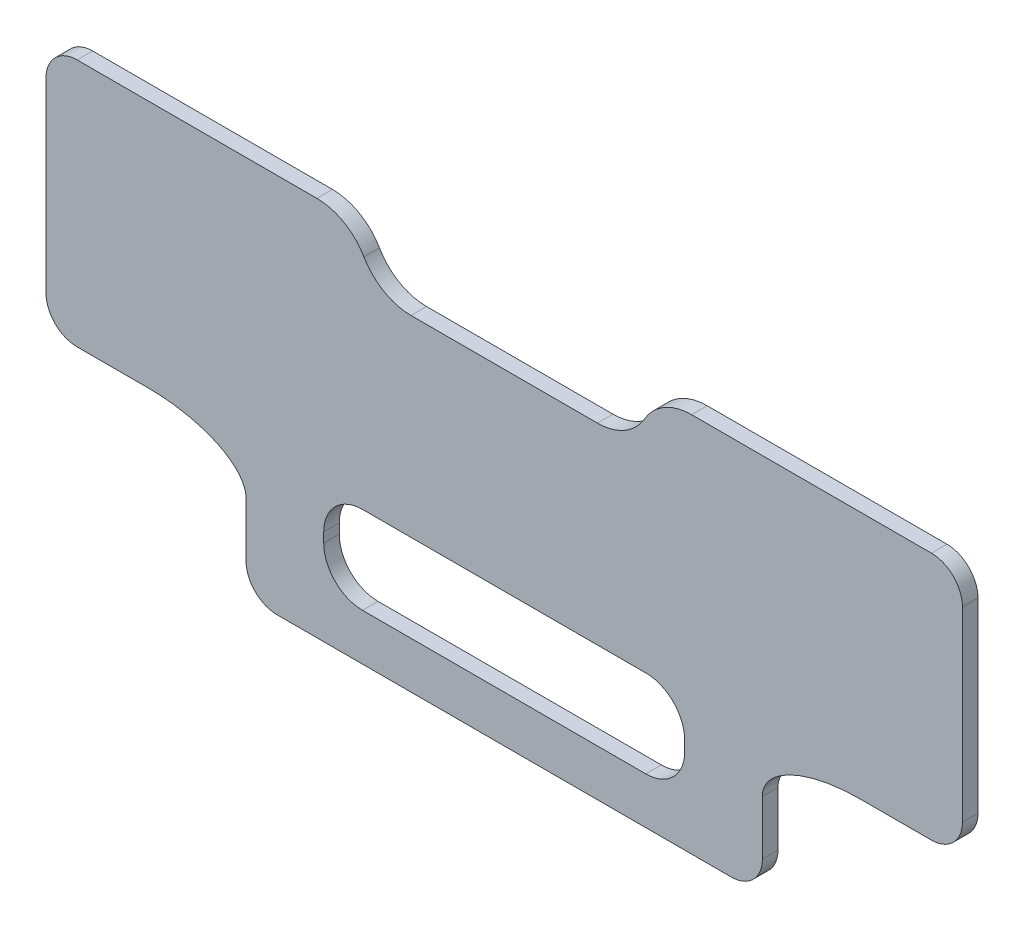
ISO-10303-21;
HEADER;
FILE_DESCRIPTION(('STEP AP214'),'2;1');
FILE_NAME('part.step','',(''),(''),'','','');
FILE_SCHEMA(('AUTOMOTIVE_DESIGN { 1 0 10303 214 1 1 1 1 }'));
ENDSEC;
DATA;
#1=APPLICATION_CONTEXT('core data for automotive mechanical design processes');
#2=APPLICATION_PROTOCOL_DEFINITION('international standard','automotive_design',2000,#1);
#3=PRODUCT_CONTEXT('',#1,'mechanical');
#4=PRODUCT('Part','Part','',(#3));
#5=PRODUCT_RELATED_PRODUCT_CATEGORY('part','',(#4));
#6=PRODUCT_DEFINITION_FORMATION('','',#4);
#7=PRODUCT_DEFINITION_CONTEXT('part definition',#1,'design');
#8=PRODUCT_DEFINITION('design','',#6,#7);
#9=PRODUCT_DEFINITION_SHAPE('','',#8);
#10=(LENGTH_UNIT() NAMED_UNIT(*) SI_UNIT(.MILLI.,.METRE.));
#11=(NAMED_UNIT(*) PLANE_ANGLE_UNIT() SI_UNIT($,.RADIAN.));
#12=(NAMED_UNIT(*) SI_UNIT($,.STERADIAN.) SOLID_ANGLE_UNIT());
#13=UNCERTAINTY_MEASURE_WITH_UNIT(LENGTH_MEASURE(1.E-05),#10,'distance_accuracy_value','');
#14=(GEOMETRIC_REPRESENTATION_CONTEXT(3) GLOBAL_UNCERTAINTY_ASSIGNED_CONTEXT((#13)) GLOBAL_UNIT_ASSIGNED_CONTEXT((#10,
#11,#12)) REPRESENTATION_CONTEXT('',''));
#15=CARTESIAN_POINT('',(0.,0.,0.));
#16=DIRECTION('',(0.,0.,1.));
#17=DIRECTION('',(1.,0.,0.));
#18=AXIS2_PLACEMENT_3D('',#15,#16,#17);
#19=CARTESIAN_POINT('',(59.,26.,2.));
#20=DIRECTION('',(0.,-1.,0.));
#21=DIRECTION('',(1.,0.,0.));
#22=AXIS2_PLACEMENT_3D('',#19,#20,#21);
#23=PLANE('',#22);
#24=DIRECTION('',(-1.,0.,0.));
#25=VECTOR('',#24,1.);
#26=CARTESIAN_POINT('',(59.,26.,0.));
#27=LINE('',#26,#25);
#28=CARTESIAN_POINT('',(-24.1243556529821,26.,0.));
#29=VERTEX_POINT('',#28);
#30=CARTESIAN_POINT('',(-55.,26.,0.));
#31=VERTEX_POINT('',#30);
#32=EDGE_CURVE('E292',#29,#31,#27,.T.);
#33=ORIENTED_EDGE('',*,*,#32,.T.);
#34=DIRECTION('',(0.,0.,-1.));
#35=VECTOR('',#34,1.);
#36=CARTESIAN_POINT('',(-55.,26.,2.));
#37=LINE('',#36,#35);
#38=CARTESIAN_POINT('',(-55.,26.,2.));
#39=VERTEX_POINT('',#38);
#40=EDGE_CURVE('E438',#31,#39,#37,.F.);
#41=ORIENTED_EDGE('',*,*,#40,.T.);
#42=DIRECTION('',(-1.,0.,0.));
#43=VECTOR('',#42,1.);
#44=CARTESIAN_POINT('',(59.,26.,2.));
#45=LINE('',#44,#43);
#46=CARTESIAN_POINT('',(-24.1243556529821,26.,2.));
#47=VERTEX_POINT('',#46);
#48=EDGE_CURVE('E286',#47,#39,#45,.T.);
#49=ORIENTED_EDGE('',*,*,#48,.F.);
#50=DIRECTION('',(0.,0.,-1.));
#51=VECTOR('',#50,1.);
#52=CARTESIAN_POINT('',(-24.1243556529821,26.,2.));
#53=LINE('',#52,#51);
#54=EDGE_CURVE('E377',#47,#29,#53,.T.);
#55=ORIENTED_EDGE('',*,*,#54,.T.);
#56=EDGE_LOOP('',(#33,#41,#49,#55));
#57=FACE_BOUND('',#56,.T.);
#58=ADVANCED_FACE('F37',(#57),#23,.F.);
#59=CARTESIAN_POINT('',(-59.,26.,2.));
#60=DIRECTION('',(1.,0.,0.));
#61=DIRECTION('',(0.,1.,0.));
#62=AXIS2_PLACEMENT_3D('',#59,#60,#61);
#63=PLANE('',#62);
#64=DIRECTION('',(0.,-1.,0.));
#65=VECTOR('',#64,1.);
#66=CARTESIAN_POINT('',(-59.,26.,2.));
#67=LINE('',#66,#65);
#68=CARTESIAN_POINT('',(-59.,22.,2.));
#69=VERTEX_POINT('',#68);
#70=CARTESIAN_POINT('',(-59.,-2.00000000000011,2.));
#71=VERTEX_POINT('',#70);
#72=EDGE_CURVE('E281',#69,#71,#67,.T.);
#73=ORIENTED_EDGE('',*,*,#72,.F.);
#74=DIRECTION('',(0.,0.,-1.));
#75=VECTOR('',#74,1.);
#76=CARTESIAN_POINT('',(-59.,22.,2.));
#77=LINE('',#76,#75);
#78=CARTESIAN_POINT('',(-59.,22.,0.));
#79=VERTEX_POINT('',#78);
#80=EDGE_CURVE('E431',#69,#79,#77,.T.);
#81=ORIENTED_EDGE('',*,*,#80,.T.);
#82=DIRECTION('',(0.,-1.,0.));
#83=VECTOR('',#82,1.);
#84=CARTESIAN_POINT('',(-59.,26.,0.));
#85=LINE('',#84,#83);
#86=CARTESIAN_POINT('',(-59.,-2.00000000000011,0.));
#87=VERTEX_POINT('',#86);
#88=EDGE_CURVE('E277',#79,#87,#85,.T.);
#89=ORIENTED_EDGE('',*,*,#88,.T.);
#90=DIRECTION('',(0.,0.,1.));
#91=VECTOR('',#90,1.);
#92=CARTESIAN_POINT('',(-59.,-2.00000000000011,2.));
#93=LINE('',#92,#91);
#94=EDGE_CURVE('E396',#87,#71,#93,.T.);
#95=ORIENTED_EDGE('',*,*,#94,.T.);
#96=EDGE_LOOP('',(#73,#81,#89,#95));
#97=FACE_BOUND('',#96,.T.);
#98=ADVANCED_FACE('F489',(#97),#63,.F.);
#99=CARTESIAN_POINT('',(59.,26.,2.));
#100=DIRECTION('',(-1.,0.,0.));
#101=DIRECTION('',(0.,0.,1.));
#102=AXIS2_PLACEMENT_3D('',#99,#100,#101);
#103=PLANE('',#102);
#104=DIRECTION('',(0.,1.,0.));
#105=VECTOR('',#104,1.);
#106=CARTESIAN_POINT('',(59.,26.,0.));
#107=LINE('',#106,#105);
#108=CARTESIAN_POINT('',(59.,-1.99999999999972,0.));
#109=VERTEX_POINT('',#108);
#110=CARTESIAN_POINT('',(59.,22.,0.));
#111=VERTEX_POINT('',#110);
#112=EDGE_CURVE('E290',#109,#111,#107,.T.);
#113=ORIENTED_EDGE('',*,*,#112,.T.);
#114=DIRECTION('',(0.,0.,-1.));
#115=VECTOR('',#114,1.);
#116=CARTESIAN_POINT('',(59.,22.,2.));
#117=LINE('',#116,#115);
#118=CARTESIAN_POINT('',(59.,22.,2.));
#119=VERTEX_POINT('',#118);
#120=EDGE_CURVE('E11',#111,#119,#117,.F.);
#121=ORIENTED_EDGE('',*,*,#120,.T.);
#122=DIRECTION('',(0.,1.,0.));
#123=VECTOR('',#122,1.);
#124=CARTESIAN_POINT('',(59.,26.,2.));
#125=LINE('',#124,#123);
#126=CARTESIAN_POINT('',(59.,-1.99999999999972,2.));
#127=VERTEX_POINT('',#126);
#128=EDGE_CURVE('E283',#127,#119,#125,.T.);
#129=ORIENTED_EDGE('',*,*,#128,.F.);
#130=DIRECTION('',(0.,0.,1.));
#131=VECTOR('',#130,1.);
#132=CARTESIAN_POINT('',(59.,-1.99999999999973,0.));
#133=LINE('',#132,#131);
#134=EDGE_CURVE('E419',#127,#109,#133,.F.);
#135=ORIENTED_EDGE('',*,*,#134,.T.);
#136=EDGE_LOOP('',(#113,#121,#129,#135));
#137=FACE_BOUND('',#136,.T.);
#138=ADVANCED_FACE('F529',(#137),#103,.F.);
#139=CARTESIAN_POINT('',(0.,0.,2.));
#140=DIRECTION('',(0.,0.,-1.));
#141=DIRECTION('',(-1.,0.,0.));
#142=AXIS2_PLACEMENT_3D('',#139,#140,#141);
#143=PLANE('',#142);
#144=DIRECTION('',(1.,0.,0.));
#145=VECTOR('',#144,1.);
#146=CARTESIAN_POINT('',(-23.2417454910334,-17.,2.));
#147=LINE('',#146,#145);
#148=CARTESIAN_POINT('',(-18.2417454910334,-17.,2.));
#149=VERTEX_POINT('',#148);
#150=CARTESIAN_POINT('',(18.241745491033,-17.,2.));
#151=VERTEX_POINT('',#150);
#152=EDGE_CURVE('E895',#149,#151,#147,.T.);
#153=ORIENTED_EDGE('',*,*,#152,.F.);
#154=CARTESIAN_POINT('',(-18.2417454910334,-12.,2.));
#155=DIRECTION('',(0.,0.,-1.));
#156=DIRECTION('',(-1.,0.,0.));
#157=AXIS2_PLACEMENT_3D('',#154,#155,#156);
#158=CIRCLE('',#157,5.);
#159=CARTESIAN_POINT('',(-23.2417454910334,-12.,2.));
#160=VERTEX_POINT('',#159);
#161=EDGE_CURVE('E354',#149,#160,#158,.T.);
#162=ORIENTED_EDGE('',*,*,#161,.T.);
#163=DIRECTION('',(0.,-1.,0.));
#164=VECTOR('',#163,1.);
#165=CARTESIAN_POINT('',(-23.2417454910334,-17.,2.));
#166=LINE('',#165,#164);
#167=CARTESIAN_POINT('',(-23.2417454910334,-10.7473478503629,2.));
#168=VERTEX_POINT('',#167);
#169=EDGE_CURVE('E888',#168,#160,#166,.T.);
#170=ORIENTED_EDGE('',*,*,#169,.F.);
#171=CARTESIAN_POINT('',(-18.2417454910334,-10.7473478503629,2.));
#172=DIRECTION('',(0.,0.,-1.));
#173=DIRECTION('',(-1.,0.,0.));
#174=AXIS2_PLACEMENT_3D('',#171,#172,#173);
#175=CIRCLE('',#174,5.);
#176=CARTESIAN_POINT('',(-18.2417454910334,-5.74734785036292,2.));
#177=VERTEX_POINT('',#176);
#178=EDGE_CURVE('E358',#168,#177,#175,.T.);
#179=ORIENTED_EDGE('',*,*,#178,.T.);
#180=DIRECTION('',(-1.,0.,0.));
#181=VECTOR('',#180,1.);
#182=CARTESIAN_POINT('',(-23.2417454910334,-5.74734785036292,2.));
#183=LINE('',#182,#181);
#184=CARTESIAN_POINT('',(18.241745491033,-5.74734785036292,2.));
#185=VERTEX_POINT('',#184);
#186=EDGE_CURVE('E906',#185,#177,#183,.T.);
#187=ORIENTED_EDGE('',*,*,#186,.F.);
#188=CARTESIAN_POINT('',(18.241745491033,-10.7473478503629,2.));
#189=DIRECTION('',(0.,0.,-1.));
#190=DIRECTION('',(-1.,0.,0.));
#191=AXIS2_PLACEMENT_3D('',#188,#189,#190);
#192=CIRCLE('',#191,5.);
#193=CARTESIAN_POINT('',(23.241745491033,-10.7473478503629,2.));
#194=VERTEX_POINT('',#193);
#195=EDGE_CURVE('E350',#185,#194,#192,.T.);
#196=ORIENTED_EDGE('',*,*,#195,.T.);
#197=DIRECTION('',(0.,1.,0.));
#198=VECTOR('',#197,1.);
#199=CARTESIAN_POINT('',(23.241745491033,-17.,2.));
#200=LINE('',#199,#198);
#201=CARTESIAN_POINT('',(23.241745491033,-12.,2.));
#202=VERTEX_POINT('',#201);
#203=EDGE_CURVE('E902',#202,#194,#200,.T.);
#204=ORIENTED_EDGE('',*,*,#203,.F.);
#205=CARTESIAN_POINT('',(18.241745491033,-12.,2.));
#206=DIRECTION('',(0.,0.,-1.));
#207=DIRECTION('',(-1.,0.,0.));
#208=AXIS2_PLACEMENT_3D('',#205,#206,#207);
#209=CIRCLE('',#208,5.);
#210=EDGE_CURVE('E346',#202,#151,#209,.T.);
#211=ORIENTED_EDGE('',*,*,#210,.T.);
#212=EDGE_LOOP('',(#153,#162,#170,#179,#187,#196,#204,#211));
#213=FACE_BOUND('',#212,.T.);
#214=ORIENTED_EDGE('',*,*,#48,.T.);
#215=CARTESIAN_POINT('',(-55.,22.,2.));
#216=DIRECTION('',(0.,0.,-1.));
#217=DIRECTION('',(-1.,0.,0.));
#218=AXIS2_PLACEMENT_3D('',#215,#216,#217);
#219=CIRCLE('',#218,4.);
#220=EDGE_CURVE('E441',#39,#69,#219,.F.);
#221=ORIENTED_EDGE('',*,*,#220,.T.);
#222=ORIENTED_EDGE('',*,*,#72,.T.);
#223=CARTESIAN_POINT('',(-55.,-2.00000000000011,2.));
#224=DIRECTION('',(0.,0.,-1.));
#225=DIRECTION('',(-1.,0.,0.));
#226=AXIS2_PLACEMENT_3D('',#223,#224,#225);
#227=CIRCLE('',#226,4.);
#228=CARTESIAN_POINT('',(-55.,-6.00000000000011,2.));
#229=VERTEX_POINT('',#228);
#230=EDGE_CURVE('E405',#71,#229,#227,.F.);
#231=ORIENTED_EDGE('',*,*,#230,.T.);
#232=DIRECTION('',(1.,0.,0.));
#233=VECTOR('',#232,1.);
#234=CARTESIAN_POINT('',(0.,-5.99999999999991,2.));
#235=LINE('',#234,#233);
#236=CARTESIAN_POINT('',(-45.8693656200782,-6.00000000000008,2.));
#237=VERTEX_POINT('',#236);
#238=EDGE_CURVE('E245',#229,#237,#235,.T.);
#239=ORIENTED_EDGE('',*,*,#238,.T.);
#240=CARTESIAN_POINT('',(-45.8693656200782,-12.0000000000001,2.));
#241=DIRECTION('',(0.,0.,1.));
#242=DIRECTION('',(-1.,0.,0.));
#243=AXIS2_PLACEMENT_3D('',#240,#241,#242);
#244=ELLIPSE('',#243,12.6276201290448,6.);
#245=CARTESIAN_POINT('',(-33.2417454910334,-12.,2.));
#246=VERTEX_POINT('',#245);
#247=EDGE_CURVE('E270',#246,#237,#244,.T.);
#248=ORIENTED_EDGE('',*,*,#247,.F.);
#249=DIRECTION('',(0.,-1.,0.));
#250=VECTOR('',#249,1.);
#251=CARTESIAN_POINT('',(-33.2417454910335,-1.25815060987073E-13,2.));
#252=LINE('',#251,#250);
#253=CARTESIAN_POINT('',(-33.2417454910334,-19.,2.));
#254=VERTEX_POINT('',#253);
#255=EDGE_CURVE('E267',#246,#254,#252,.T.);
#256=ORIENTED_EDGE('',*,*,#255,.T.);
#257=CARTESIAN_POINT('',(-29.2417454910334,-19.,2.));
#258=DIRECTION('',(0.,0.,-1.));
#259=DIRECTION('',(-1.,0.,0.));
#260=AXIS2_PLACEMENT_3D('',#257,#258,#259);
#261=CIRCLE('',#260,4.);
#262=CARTESIAN_POINT('',(-29.2417454910334,-23.,2.));
#263=VERTEX_POINT('',#262);
#264=EDGE_CURVE('E399',#254,#263,#261,.F.);
#265=ORIENTED_EDGE('',*,*,#264,.T.);
#266=DIRECTION('',(1.,0.,0.));
#267=VECTOR('',#266,1.);
#268=CARTESIAN_POINT('',(0.,-22.9999999999999,2.));
#269=LINE('',#268,#267);
#270=CARTESIAN_POINT('',(29.241745491033,-22.9999999999998,2.));
#271=VERTEX_POINT('',#270);
#272=EDGE_CURVE('E261',#263,#271,#269,.T.);
#273=ORIENTED_EDGE('',*,*,#272,.T.);
#274=CARTESIAN_POINT('',(29.241745491033,-18.9999999999998,2.));
#275=DIRECTION('',(0.,0.,-1.));
#276=DIRECTION('',(-1.,0.,0.));
#277=AXIS2_PLACEMENT_3D('',#274,#275,#276);
#278=CIRCLE('',#277,4.);
#279=CARTESIAN_POINT('',(33.241745491033,-18.9999999999998,2.));
#280=VERTEX_POINT('',#279);
#281=EDGE_CURVE('E401',#271,#280,#278,.F.);
#282=ORIENTED_EDGE('',*,*,#281,.T.);
#283=DIRECTION('',(0.,1.,0.));
#284=VECTOR('',#283,1.);
#285=CARTESIAN_POINT('',(33.2417454910329,1.4678423781825E-13,2.));
#286=LINE('',#285,#284);
#287=CARTESIAN_POINT('',(33.2417454910329,-11.9999999999998,2.));
#288=VERTEX_POINT('',#287);
#289=EDGE_CURVE('E258',#280,#288,#286,.T.);
#290=ORIENTED_EDGE('',*,*,#289,.T.);
#291=CARTESIAN_POINT('',(45.8693656200778,-11.9999999999998,2.));
#292=DIRECTION('',(0.,0.,1.));
#293=DIRECTION('',(1.,0.,0.));
#294=AXIS2_PLACEMENT_3D('',#291,#292,#293);
#295=ELLIPSE('',#294,12.6276201290448,6.);
#296=CARTESIAN_POINT('',(45.8693656200777,-5.99999999999976,2.));
#297=VERTEX_POINT('',#296);
#298=EDGE_CURVE('E239',#297,#288,#295,.T.);
#299=ORIENTED_EDGE('',*,*,#298,.F.);
#300=DIRECTION('',(1.,0.,0.));
#301=VECTOR('',#300,1.);
#302=CARTESIAN_POINT('',(0.,-5.99999999999992,2.));
#303=LINE('',#302,#301);
#304=CARTESIAN_POINT('',(55.,-5.99999999999973,2.));
#305=VERTEX_POINT('',#304);
#306=EDGE_CURVE('E249',#297,#305,#303,.T.);
#307=ORIENTED_EDGE('',*,*,#306,.T.);
#308=CARTESIAN_POINT('',(55.,-1.99999999999973,2.));
#309=DIRECTION('',(0.,0.,-1.));
#310=DIRECTION('',(-1.,0.,0.));
#311=AXIS2_PLACEMENT_3D('',#308,#309,#310);
#312=CIRCLE('',#311,4.);
#313=EDGE_CURVE('E403',#305,#127,#312,.F.);
#314=ORIENTED_EDGE('',*,*,#313,.T.);
#315=ORIENTED_EDGE('',*,*,#128,.T.);
#316=CARTESIAN_POINT('',(55.,22.,2.));
#317=DIRECTION('',(0.,0.,-1.));
#318=DIRECTION('',(-1.,0.,0.));
#319=AXIS2_PLACEMENT_3D('',#316,#317,#318);
#320=CIRCLE('',#319,4.);
#321=CARTESIAN_POINT('',(55.,26.,2.));
#322=VERTEX_POINT('',#321);
#323=EDGE_CURVE('E52',#119,#322,#320,.F.);
#324=ORIENTED_EDGE('',*,*,#323,.T.);
#325=CARTESIAN_POINT('',(24.1243556529821,26.,2.));
#326=VERTEX_POINT('',#325);
#327=EDGE_CURVE('E287',#322,#326,#45,.T.);
#328=ORIENTED_EDGE('',*,*,#327,.T.);
#329=CARTESIAN_POINT('',(24.1243556529821,19.,2.));
#330=DIRECTION('',(0.,0.,-1.));
#331=DIRECTION('',(-1.,0.,0.));
#332=AXIS2_PLACEMENT_3D('',#329,#330,#331);
#333=CIRCLE('',#332,7.);
#334=CARTESIAN_POINT('',(18.0621778264911,22.5,2.));
#335=VERTEX_POINT('',#334);
#336=EDGE_CURVE('E387',#326,#335,#333,.F.);
#337=ORIENTED_EDGE('',*,*,#336,.T.);
#338=CARTESIAN_POINT('',(12.,26.,2.));
#339=DIRECTION('',(0.,0.,-1.));
#340=DIRECTION('',(-1.,0.,0.));
#341=AXIS2_PLACEMENT_3D('',#338,#339,#340);
#342=CIRCLE('',#341,7.);
#343=CARTESIAN_POINT('',(12.,19.,2.));
#344=VERTEX_POINT('',#343);
#345=EDGE_CURVE('E367',#335,#344,#342,.T.);
#346=ORIENTED_EDGE('',*,*,#345,.T.);
#347=DIRECTION('',(1.,0.,0.));
#348=VECTOR('',#347,1.);
#349=CARTESIAN_POINT('',(-19.,19.,2.));
#350=LINE('',#349,#348);
#351=CARTESIAN_POINT('',(-12.,19.,2.));
#352=VERTEX_POINT('',#351);
#353=EDGE_CURVE('E253',#352,#344,#350,.T.);
#354=ORIENTED_EDGE('',*,*,#353,.F.);
#355=CARTESIAN_POINT('',(-12.,26.,2.));
#356=DIRECTION('',(0.,0.,-1.));
#357=DIRECTION('',(-1.,0.,0.));
#358=AXIS2_PLACEMENT_3D('',#355,#356,#357);
#359=CIRCLE('',#358,7.);
#360=CARTESIAN_POINT('',(-18.0621778264911,22.5,2.));
#361=VERTEX_POINT('',#360);
#362=EDGE_CURVE('E372',#352,#361,#359,.T.);
#363=ORIENTED_EDGE('',*,*,#362,.T.);
#364=CARTESIAN_POINT('',(-24.1243556529821,19.,2.));
#365=DIRECTION('',(0.,0.,-1.));
#366=DIRECTION('',(-1.,0.,0.));
#367=AXIS2_PLACEMENT_3D('',#364,#365,#366);
#368=CIRCLE('',#367,7.);
#369=EDGE_CURVE('E389',#361,#47,#368,.F.);
#370=ORIENTED_EDGE('',*,*,#369,.T.);
#371=EDGE_LOOP('',(#214,#221,#222,#231,#239,#248,#256,#265,#273,#282,#290,#299,#307,#314,#315,
#324,#328,#337,#346,#354,#363,#370));
#372=FACE_BOUND('',#371,.T.);
#373=ADVANCED_FACE('F256',(#213,#372),#143,.F.);
#374=CARTESIAN_POINT('',(0.,0.,0.));
#375=DIRECTION('',(0.,0.,-1.));
#376=DIRECTION('',(-1.,0.,0.));
#377=AXIS2_PLACEMENT_3D('',#374,#375,#376);
#378=PLANE('',#377);
#379=DIRECTION('',(0.,1.,0.));
#380=VECTOR('',#379,1.);
#381=CARTESIAN_POINT('',(-23.2417454910334,0.,0.));
#382=LINE('',#381,#380);
#383=CARTESIAN_POINT('',(-23.2417454910334,-12.,0.));
#384=VERTEX_POINT('',#383);
#385=CARTESIAN_POINT('',(-23.2417454910334,-10.7473478503629,0.));
#386=VERTEX_POINT('',#385);
#387=EDGE_CURVE('E323',#384,#386,#382,.T.);
#388=ORIENTED_EDGE('',*,*,#387,.F.);
#389=CARTESIAN_POINT('',(-18.2417454910334,-12.,0.));
#390=DIRECTION('',(0.,0.,-1.));
#391=DIRECTION('',(-1.,0.,0.));
#392=AXIS2_PLACEMENT_3D('',#389,#390,#391);
#393=CIRCLE('',#392,5.);
#394=CARTESIAN_POINT('',(-18.2417454910334,-17.,0.));
#395=VERTEX_POINT('',#394);
#396=EDGE_CURVE('E356',#384,#395,#393,.F.);
#397=ORIENTED_EDGE('',*,*,#396,.T.);
#398=DIRECTION('',(-1.,0.,0.));
#399=VECTOR('',#398,1.);
#400=CARTESIAN_POINT('',(0.,-17.,0.));
#401=LINE('',#400,#399);
#402=CARTESIAN_POINT('',(18.241745491033,-17.,0.));
#403=VERTEX_POINT('',#402);
#404=EDGE_CURVE('E314',#403,#395,#401,.T.);
#405=ORIENTED_EDGE('',*,*,#404,.F.);
#406=CARTESIAN_POINT('',(18.241745491033,-12.,0.));
#407=DIRECTION('',(0.,0.,-1.));
#408=DIRECTION('',(-1.,0.,0.));
#409=AXIS2_PLACEMENT_3D('',#406,#407,#408);
#410=CIRCLE('',#409,5.);
#411=CARTESIAN_POINT('',(23.241745491033,-12.,0.));
#412=VERTEX_POINT('',#411);
#413=EDGE_CURVE('E348',#403,#412,#410,.F.);
#414=ORIENTED_EDGE('',*,*,#413,.T.);
#415=DIRECTION('',(0.,-1.,0.));
#416=VECTOR('',#415,1.);
#417=CARTESIAN_POINT('',(23.241745491033,0.,0.));
#418=LINE('',#417,#416);
#419=CARTESIAN_POINT('',(23.241745491033,-10.7473478503629,0.));
#420=VERTEX_POINT('',#419);
#421=EDGE_CURVE('E317',#420,#412,#418,.T.);
#422=ORIENTED_EDGE('',*,*,#421,.F.);
#423=CARTESIAN_POINT('',(18.241745491033,-10.7473478503629,0.));
#424=DIRECTION('',(0.,0.,-1.));
#425=DIRECTION('',(-1.,0.,0.));
#426=AXIS2_PLACEMENT_3D('',#423,#424,#425);
#427=CIRCLE('',#426,5.);
#428=CARTESIAN_POINT('',(18.241745491033,-5.74734785036292,0.));
#429=VERTEX_POINT('',#428);
#430=EDGE_CURVE('E352',#420,#429,#427,.F.);
#431=ORIENTED_EDGE('',*,*,#430,.T.);
#432=DIRECTION('',(1.,0.,0.));
#433=VECTOR('',#432,1.);
#434=CARTESIAN_POINT('',(0.,-5.74734785036292,0.));
#435=LINE('',#434,#433);
#436=CARTESIAN_POINT('',(-18.2417454910334,-5.74734785036292,0.));
#437=VERTEX_POINT('',#436);
#438=EDGE_CURVE('E320',#437,#429,#435,.T.);
#439=ORIENTED_EDGE('',*,*,#438,.F.);
#440=CARTESIAN_POINT('',(-18.2417454910334,-10.7473478503629,0.));
#441=DIRECTION('',(0.,0.,-1.));
#442=DIRECTION('',(-1.,0.,0.));
#443=AXIS2_PLACEMENT_3D('',#440,#441,#442);
#444=CIRCLE('',#443,5.);
#445=EDGE_CURVE('E360',#437,#386,#444,.F.);
#446=ORIENTED_EDGE('',*,*,#445,.T.);
#447=EDGE_LOOP('',(#388,#397,#405,#414,#422,#431,#439,#446));
#448=FACE_BOUND('',#447,.T.);
#449=ORIENTED_EDGE('',*,*,#88,.F.);
#450=CARTESIAN_POINT('',(-55.,22.,0.));
#451=DIRECTION('',(0.,0.,-1.));
#452=DIRECTION('',(-1.,0.,0.));
#453=AXIS2_PLACEMENT_3D('',#450,#451,#452);
#454=CIRCLE('',#453,4.);
#455=EDGE_CURVE('E436',#79,#31,#454,.T.);
#456=ORIENTED_EDGE('',*,*,#455,.T.);
#457=ORIENTED_EDGE('',*,*,#32,.F.);
#458=CARTESIAN_POINT('',(-24.1243556529821,19.,0.));
#459=DIRECTION('',(0.,0.,-1.));
#460=DIRECTION('',(-1.,0.,0.));
#461=AXIS2_PLACEMENT_3D('',#458,#459,#460);
#462=CIRCLE('',#461,7.);
#463=CARTESIAN_POINT('',(-18.0621778264911,22.5,0.));
#464=VERTEX_POINT('',#463);
#465=EDGE_CURVE('E383',#29,#464,#462,.T.);
#466=ORIENTED_EDGE('',*,*,#465,.T.);
#467=CARTESIAN_POINT('',(-12.,26.,0.));
#468=DIRECTION('',(0.,0.,-1.));
#469=DIRECTION('',(-1.,0.,0.));
#470=AXIS2_PLACEMENT_3D('',#467,#468,#469);
#471=CIRCLE('',#470,7.);
#472=CARTESIAN_POINT('',(-12.,19.,0.));
#473=VERTEX_POINT('',#472);
#474=EDGE_CURVE('E375',#464,#473,#471,.F.);
#475=ORIENTED_EDGE('',*,*,#474,.T.);
#476=DIRECTION('',(-1.,0.,0.));
#477=VECTOR('',#476,1.);
#478=CARTESIAN_POINT('',(0.,19.,0.));
#479=LINE('',#478,#477);
#480=CARTESIAN_POINT('',(12.,19.,0.));
#481=VERTEX_POINT('',#480);
#482=EDGE_CURVE('E311',#481,#473,#479,.T.);
#483=ORIENTED_EDGE('',*,*,#482,.F.);
#484=CARTESIAN_POINT('',(12.,26.,0.));
#485=DIRECTION('',(0.,0.,-1.));
#486=DIRECTION('',(-1.,0.,0.));
#487=AXIS2_PLACEMENT_3D('',#484,#485,#486);
#488=CIRCLE('',#487,7.);
#489=CARTESIAN_POINT('',(18.0621778264911,22.5,0.));
#490=VERTEX_POINT('',#489);
#491=EDGE_CURVE('E369',#481,#490,#488,.F.);
#492=ORIENTED_EDGE('',*,*,#491,.T.);
#493=CARTESIAN_POINT('',(24.1243556529821,19.,0.));
#494=DIRECTION('',(0.,0.,-1.));
#495=DIRECTION('',(-1.,0.,0.));
#496=AXIS2_PLACEMENT_3D('',#493,#494,#495);
#497=CIRCLE('',#496,7.);
#498=CARTESIAN_POINT('',(24.1243556529821,26.,0.));
#499=VERTEX_POINT('',#498);
#500=EDGE_CURVE('E380',#490,#499,#497,.T.);
#501=ORIENTED_EDGE('',*,*,#500,.T.);
#502=CARTESIAN_POINT('',(55.,26.,0.));
#503=VERTEX_POINT('',#502);
#504=EDGE_CURVE('E284',#503,#499,#27,.T.);
#505=ORIENTED_EDGE('',*,*,#504,.F.);
#506=CARTESIAN_POINT('',(55.,22.,0.));
#507=DIRECTION('',(0.,0.,-1.));
#508=DIRECTION('',(-1.,0.,0.));
#509=AXIS2_PLACEMENT_3D('',#506,#507,#508);
#510=CIRCLE('',#509,4.);
#511=EDGE_CURVE('E434',#503,#111,#510,.T.);
#512=ORIENTED_EDGE('',*,*,#511,.T.);
#513=ORIENTED_EDGE('',*,*,#112,.F.);
#514=CARTESIAN_POINT('',(55.,-1.99999999999973,0.));
#515=DIRECTION('',(0.,0.,-1.));
#516=DIRECTION('',(-1.,0.,0.));
#517=AXIS2_PLACEMENT_3D('',#514,#515,#516);
#518=CIRCLE('',#517,4.);
#519=CARTESIAN_POINT('',(55.,-5.99999999999973,0.));
#520=VERTEX_POINT('',#519);
#521=EDGE_CURVE('E413',#109,#520,#518,.T.);
#522=ORIENTED_EDGE('',*,*,#521,.T.);
#523=DIRECTION('',(-1.,0.,0.));
#524=VECTOR('',#523,1.);
#525=CARTESIAN_POINT('',(0.,-5.99999999999992,0.));
#526=LINE('',#525,#524);
#527=CARTESIAN_POINT('',(45.8693656200777,-5.99999999999976,0.));
#528=VERTEX_POINT('',#527);
#529=EDGE_CURVE('E309',#520,#528,#526,.T.);
#530=ORIENTED_EDGE('',*,*,#529,.T.);
#531=CARTESIAN_POINT('',(45.8693656200778,-11.9999999999998,0.));
#532=DIRECTION('',(0.,0.,1.));
#533=DIRECTION('',(1.,0.,0.));
#534=AXIS2_PLACEMENT_3D('',#531,#532,#533);
#535=ELLIPSE('',#534,12.6276201290448,6.);
#536=CARTESIAN_POINT('',(33.2417454910329,-11.9999999999998,0.));
#537=VERTEX_POINT('',#536);
#538=EDGE_CURVE('E241',#537,#528,#535,.F.);
#539=ORIENTED_EDGE('',*,*,#538,.F.);
#540=DIRECTION('',(0.,-1.,0.));
#541=VECTOR('',#540,1.);
#542=CARTESIAN_POINT('',(33.2417454910329,1.4678423781825E-13,0.));
#543=LINE('',#542,#541);
#544=CARTESIAN_POINT('',(33.241745491033,-18.9999999999998,0.));
#545=VERTEX_POINT('',#544);
#546=EDGE_CURVE('E295',#537,#545,#543,.T.);
#547=ORIENTED_EDGE('',*,*,#546,.T.);
#548=CARTESIAN_POINT('',(29.241745491033,-18.9999999999998,0.));
#549=DIRECTION('',(0.,0.,-1.));
#550=DIRECTION('',(-1.,0.,0.));
#551=AXIS2_PLACEMENT_3D('',#548,#549,#550);
#552=CIRCLE('',#551,4.);
#553=CARTESIAN_POINT('',(29.241745491033,-22.9999999999998,0.));
#554=VERTEX_POINT('',#553);
#555=EDGE_CURVE('E411',#545,#554,#552,.T.);
#556=ORIENTED_EDGE('',*,*,#555,.T.);
#557=DIRECTION('',(-1.,0.,0.));
#558=VECTOR('',#557,1.);
#559=CARTESIAN_POINT('',(0.,-22.9999999999999,0.));
#560=LINE('',#559,#558);
#561=CARTESIAN_POINT('',(-29.2417454910334,-23.,0.));
#562=VERTEX_POINT('',#561);
#563=EDGE_CURVE('E298',#554,#562,#560,.T.);
#564=ORIENTED_EDGE('',*,*,#563,.T.);
#565=CARTESIAN_POINT('',(-29.2417454910334,-19.,0.));
#566=DIRECTION('',(0.,0.,-1.));
#567=DIRECTION('',(-1.,0.,0.));
#568=AXIS2_PLACEMENT_3D('',#565,#566,#567);
#569=CIRCLE('',#568,4.);
#570=CARTESIAN_POINT('',(-33.2417454910334,-19.,0.));
#571=VERTEX_POINT('',#570);
#572=EDGE_CURVE('E409',#562,#571,#569,.T.);
#573=ORIENTED_EDGE('',*,*,#572,.T.);
#574=DIRECTION('',(0.,1.,0.));
#575=VECTOR('',#574,1.);
#576=CARTESIAN_POINT('',(-33.2417454910335,-1.25815060987073E-13,0.));
#577=LINE('',#576,#575);
#578=CARTESIAN_POINT('',(-33.2417454910334,-12.,0.));
#579=VERTEX_POINT('',#578);
#580=EDGE_CURVE('E301',#571,#579,#577,.T.);
#581=ORIENTED_EDGE('',*,*,#580,.T.);
#582=CARTESIAN_POINT('',(-45.8693656200782,-12.0000000000001,0.));
#583=DIRECTION('',(0.,0.,1.));
#584=DIRECTION('',(-1.,0.,0.));
#585=AXIS2_PLACEMENT_3D('',#582,#583,#584);
#586=ELLIPSE('',#585,12.6276201290448,6.);
#587=CARTESIAN_POINT('',(-45.8693656200782,-6.00000000000008,0.));
#588=VERTEX_POINT('',#587);
#589=EDGE_CURVE('E303',#588,#579,#586,.F.);
#590=ORIENTED_EDGE('',*,*,#589,.F.);
#591=DIRECTION('',(-1.,0.,0.));
#592=VECTOR('',#591,1.);
#593=CARTESIAN_POINT('',(0.,-5.99999999999991,0.));
#594=LINE('',#593,#592);
#595=CARTESIAN_POINT('',(-55.,-6.00000000000011,0.));
#596=VERTEX_POINT('',#595);
#597=EDGE_CURVE('E306',#588,#596,#594,.T.);
#598=ORIENTED_EDGE('',*,*,#597,.T.);
#599=CARTESIAN_POINT('',(-55.,-2.00000000000011,0.));
#600=DIRECTION('',(0.,0.,-1.));
#601=DIRECTION('',(-1.,0.,0.));
#602=AXIS2_PLACEMENT_3D('',#599,#600,#601);
#603=CIRCLE('',#602,4.);
#604=EDGE_CURVE('E415',#596,#87,#603,.T.);
#605=ORIENTED_EDGE('',*,*,#604,.T.);
#606=EDGE_LOOP('',(#449,#456,#457,#466,#475,#483,#492,#501,#505,#512,#513,#522,#530,#539,#547,
#556,#564,#573,#581,#590,#598,#605));
#607=FACE_BOUND('',#606,.T.);
#608=ADVANCED_FACE('F450',(#448,#607),#378,.T.);
#609=ORIENTED_EDGE('',*,*,#327,.F.);
#610=DIRECTION('',(0.,0.,-1.));
#611=VECTOR('',#610,1.);
#612=CARTESIAN_POINT('',(55.,26.,2.));
#613=LINE('',#612,#611);
#614=EDGE_CURVE('E45',#322,#503,#613,.T.);
#615=ORIENTED_EDGE('',*,*,#614,.T.);
#616=ORIENTED_EDGE('',*,*,#504,.T.);
#617=DIRECTION('',(0.,0.,-1.));
#618=VECTOR('',#617,1.);
#619=CARTESIAN_POINT('',(24.1243556529821,26.,2.));
#620=LINE('',#619,#618);
#621=EDGE_CURVE('E391',#499,#326,#620,.F.);
#622=ORIENTED_EDGE('',*,*,#621,.T.);
#623=EDGE_LOOP('',(#609,#615,#616,#622));
#624=FACE_BOUND('',#623,.T.);
#625=ADVANCED_FACE('F446',(#624),#23,.F.);
#626=CARTESIAN_POINT('',(0.,-5.99999999999992,-8.));
#627=DIRECTION('',(0.,-1.,0.));
#628=DIRECTION('',(1.,0.,0.));
#629=AXIS2_PLACEMENT_3D('',#626,#627,#628);
#630=PLANE('',#629);
#631=ORIENTED_EDGE('',*,*,#529,.F.);
#632=DIRECTION('',(0.,0.,1.));
#633=VECTOR('',#632,1.);
#634=CARTESIAN_POINT('',(55.,-5.99999999999973,2.));
#635=LINE('',#634,#633);
#636=EDGE_CURVE('E252',#520,#305,#635,.T.);
#637=ORIENTED_EDGE('',*,*,#636,.T.);
#638=ORIENTED_EDGE('',*,*,#306,.F.);
#639=DIRECTION('',(0.,0.,1.));
#640=VECTOR('',#639,1.);
#641=CARTESIAN_POINT('',(45.8693656200777,-5.99999999999976,-8.));
#642=LINE('',#641,#640);
#643=EDGE_CURVE('E235',#528,#297,#642,.T.);
#644=ORIENTED_EDGE('',*,*,#643,.F.);
#645=EDGE_LOOP('',(#631,#637,#638,#644));
#646=FACE_BOUND('',#645,.T.);
#647=ADVANCED_FACE('F250',(#646),#630,.T.);
#648=CARTESIAN_POINT('',(0.,-5.99999999999991,-8.));
#649=DIRECTION('',(0.,-1.,0.));
#650=DIRECTION('',(1.,0.,0.));
#651=AXIS2_PLACEMENT_3D('',#648,#649,#650);
#652=PLANE('',#651);
#653=ORIENTED_EDGE('',*,*,#238,.F.);
#654=DIRECTION('',(0.,0.,1.));
#655=VECTOR('',#654,1.);
#656=CARTESIAN_POINT('',(-55.,-6.00000000000011,0.));
#657=LINE('',#656,#655);
#658=EDGE_CURVE('E407',#229,#596,#657,.F.);
#659=ORIENTED_EDGE('',*,*,#658,.T.);
#660=ORIENTED_EDGE('',*,*,#597,.F.);
#661=DIRECTION('',(0.,0.,1.));
#662=VECTOR('',#661,1.);
#663=CARTESIAN_POINT('',(-45.8693656200782,-6.00000000000008,-8.));
#664=LINE('',#663,#662);
#665=EDGE_CURVE('E274',#588,#237,#664,.T.);
#666=ORIENTED_EDGE('',*,*,#665,.T.);
#667=EDGE_LOOP('',(#653,#659,#660,#666));
#668=FACE_BOUND('',#667,.T.);
#669=ADVANCED_FACE('F498',(#668),#652,.T.);
#670=CARTESIAN_POINT('',(-45.8693656200782,-12.0000000000001,-8.));
#671=DIRECTION('',(0.,0.,1.));
#672=DIRECTION('',(-1.,0.,0.));
#673=AXIS2_PLACEMENT_3D('',#670,#671,#672);
#674=ELLIPSE('',#673,12.6276201290448,6.);
#675=DIRECTION('',(0.,0.,1.));
#676=VECTOR('',#675,1.);
#677=SURFACE_OF_LINEAR_EXTRUSION('',#674,#676);
#678=ORIENTED_EDGE('',*,*,#589,.T.);
#679=DIRECTION('',(0.,0.,1.));
#680=VECTOR('',#679,1.);
#681=CARTESIAN_POINT('',(-33.2417454910334,-12.,-8.));
#682=LINE('',#681,#680);
#683=EDGE_CURVE('E278',#579,#246,#682,.T.);
#684=ORIENTED_EDGE('',*,*,#683,.T.);
#685=ORIENTED_EDGE('',*,*,#247,.T.);
#686=ORIENTED_EDGE('',*,*,#665,.F.);
#687=EDGE_LOOP('',(#678,#684,#685,#686));
#688=FACE_BOUND('',#687,.T.);
#689=ADVANCED_FACE('F502',(#688),#677,.F.);
#690=CARTESIAN_POINT('',(-33.2417454910335,-1.25815060987073E-13,-8.));
#691=DIRECTION('',(-1.,0.,0.));
#692=DIRECTION('',(0.,-1.,0.));
#693=AXIS2_PLACEMENT_3D('',#690,#691,#692);
#694=PLANE('',#693);
#695=ORIENTED_EDGE('',*,*,#580,.F.);
#696=DIRECTION('',(0.,0.,1.));
#697=VECTOR('',#696,1.);
#698=CARTESIAN_POINT('',(-33.2417454910334,-19.,-8.));
#699=LINE('',#698,#697);
#700=EDGE_CURVE('E428',#571,#254,#699,.T.);
#701=ORIENTED_EDGE('',*,*,#700,.T.);
#702=ORIENTED_EDGE('',*,*,#255,.F.);
#703=ORIENTED_EDGE('',*,*,#683,.F.);
#704=EDGE_LOOP('',(#695,#701,#702,#703));
#705=FACE_BOUND('',#704,.T.);
#706=ADVANCED_FACE('F508',(#705),#694,.T.);
#707=CARTESIAN_POINT('',(0.,-22.9999999999999,-8.));
#708=DIRECTION('',(0.,-1.,0.));
#709=DIRECTION('',(1.,0.,0.));
#710=AXIS2_PLACEMENT_3D('',#707,#708,#709);
#711=PLANE('',#710);
#712=ORIENTED_EDGE('',*,*,#563,.F.);
#713=DIRECTION('',(0.,0.,1.));
#714=VECTOR('',#713,1.);
#715=CARTESIAN_POINT('',(29.241745491033,-22.9999999999998,-8.));
#716=LINE('',#715,#714);
#717=EDGE_CURVE('E423',#554,#271,#716,.T.);
#718=ORIENTED_EDGE('',*,*,#717,.T.);
#719=ORIENTED_EDGE('',*,*,#272,.F.);
#720=DIRECTION('',(0.,0.,1.));
#721=VECTOR('',#720,1.);
#722=CARTESIAN_POINT('',(-29.2417454910334,-23.,-8.));
#723=LINE('',#722,#721);
#724=EDGE_CURVE('E421',#263,#562,#723,.F.);
#725=ORIENTED_EDGE('',*,*,#724,.T.);
#726=EDGE_LOOP('',(#712,#718,#719,#725));
#727=FACE_BOUND('',#726,.T.);
#728=ADVANCED_FACE('F516',(#727),#711,.T.);
#729=CARTESIAN_POINT('',(33.2417454910329,1.4678423781825E-13,-8.));
#730=DIRECTION('',(1.,0.,0.));
#731=DIRECTION('',(0.,1.,0.));
#732=AXIS2_PLACEMENT_3D('',#729,#730,#731);
#733=PLANE('',#732);
#734=ORIENTED_EDGE('',*,*,#289,.F.);
#735=DIRECTION('',(0.,0.,1.));
#736=VECTOR('',#735,1.);
#737=CARTESIAN_POINT('',(33.241745491033,-18.9999999999998,-8.));
#738=LINE('',#737,#736);
#739=EDGE_CURVE('E426',#280,#545,#738,.F.);
#740=ORIENTED_EDGE('',*,*,#739,.T.);
#741=ORIENTED_EDGE('',*,*,#546,.F.);
#742=DIRECTION('',(0.,0.,1.));
#743=VECTOR('',#742,1.);
#744=CARTESIAN_POINT('',(33.2417454910329,-11.9999999999998,-8.));
#745=LINE('',#744,#743);
#746=EDGE_CURVE('E244',#537,#288,#745,.T.);
#747=ORIENTED_EDGE('',*,*,#746,.T.);
#748=EDGE_LOOP('',(#734,#740,#741,#747));
#749=FACE_BOUND('',#748,.T.);
#750=ADVANCED_FACE('F524',(#749),#733,.T.);
#751=CARTESIAN_POINT('',(45.8693656200778,-11.9999999999998,-8.));
#752=DIRECTION('',(0.,0.,1.));
#753=DIRECTION('',(1.,0.,0.));
#754=AXIS2_PLACEMENT_3D('',#751,#752,#753);
#755=ELLIPSE('',#754,12.6276201290448,6.);
#756=DIRECTION('',(0.,0.,1.));
#757=VECTOR('',#756,1.);
#758=SURFACE_OF_LINEAR_EXTRUSION('',#755,#757);
#759=ORIENTED_EDGE('',*,*,#538,.T.);
#760=ORIENTED_EDGE('',*,*,#643,.T.);
#761=ORIENTED_EDGE('',*,*,#298,.T.);
#762=ORIENTED_EDGE('',*,*,#746,.F.);
#763=EDGE_LOOP('',(#759,#760,#761,#762));
#764=FACE_BOUND('',#763,.T.);
#765=ADVANCED_FACE('F237',(#764),#758,.F.);
#766=CARTESIAN_POINT('',(-19.,19.,-8.));
#767=DIRECTION('',(0.,-1.,0.));
#768=DIRECTION('',(0.,0.,-1.));
#769=AXIS2_PLACEMENT_3D('',#766,#767,#768);
#770=PLANE('',#769);
#771=ORIENTED_EDGE('',*,*,#353,.T.);
#772=DIRECTION('',(0.,0.,1.));
#773=VECTOR('',#772,1.);
#774=CARTESIAN_POINT('',(12.,19.,0.));
#775=LINE('',#774,#773);
#776=EDGE_CURVE('E365',#344,#481,#775,.F.);
#777=ORIENTED_EDGE('',*,*,#776,.T.);
#778=ORIENTED_EDGE('',*,*,#482,.T.);
#779=DIRECTION('',(0.,0.,1.));
#780=VECTOR('',#779,1.);
#781=CARTESIAN_POINT('',(-12.,19.,2.));
#782=LINE('',#781,#780);
#783=EDGE_CURVE('E362',#473,#352,#782,.T.);
#784=ORIENTED_EDGE('',*,*,#783,.T.);
#785=EDGE_LOOP('',(#771,#777,#778,#784));
#786=FACE_BOUND('',#785,.T.);
#787=ADVANCED_FACE('F467',(#786),#770,.F.);
#788=CARTESIAN_POINT('',(-23.2417454910334,-17.,-8.));
#789=DIRECTION('',(-1.,0.,0.));
#790=DIRECTION('',(0.,0.,1.));
#791=AXIS2_PLACEMENT_3D('',#788,#789,#790);
#792=PLANE('',#791);
#793=ORIENTED_EDGE('',*,*,#169,.T.);
#794=DIRECTION('',(0.,0.,1.));
#795=VECTOR('',#794,1.);
#796=CARTESIAN_POINT('',(-23.2417454910334,-12.,0.));
#797=LINE('',#796,#795);
#798=EDGE_CURVE('E344',#160,#384,#797,.F.);
#799=ORIENTED_EDGE('',*,*,#798,.T.);
#800=ORIENTED_EDGE('',*,*,#387,.T.);
#801=DIRECTION('',(0.,0.,1.));
#802=VECTOR('',#801,1.);
#803=CARTESIAN_POINT('',(-23.2417454910334,-10.7473478503629,2.));
#804=LINE('',#803,#802);
#805=EDGE_CURVE('E341',#386,#168,#804,.T.);
#806=ORIENTED_EDGE('',*,*,#805,.T.);
#807=EDGE_LOOP('',(#793,#799,#800,#806));
#808=FACE_BOUND('',#807,.T.);
#809=ADVANCED_FACE('F591',(#808),#792,.F.);
#810=CARTESIAN_POINT('',(-23.2417454910334,-5.74734785036292,-8.));
#811=DIRECTION('',(0.,1.,0.));
#812=DIRECTION('',(0.,0.,1.));
#813=AXIS2_PLACEMENT_3D('',#810,#811,#812);
#814=PLANE('',#813);
#815=ORIENTED_EDGE('',*,*,#438,.T.);
#816=DIRECTION('',(0.,0.,1.));
#817=VECTOR('',#816,1.);
#818=CARTESIAN_POINT('',(18.241745491033,-5.74734785036292,2.));
#819=LINE('',#818,#817);
#820=EDGE_CURVE('E338',#429,#185,#819,.T.);
#821=ORIENTED_EDGE('',*,*,#820,.T.);
#822=ORIENTED_EDGE('',*,*,#186,.T.);
#823=DIRECTION('',(0.,0.,1.));
#824=VECTOR('',#823,1.);
#825=CARTESIAN_POINT('',(-18.2417454910334,-5.74734785036292,0.));
#826=LINE('',#825,#824);
#827=EDGE_CURVE('E336',#177,#437,#826,.F.);
#828=ORIENTED_EDGE('',*,*,#827,.T.);
#829=EDGE_LOOP('',(#815,#821,#822,#828));
#830=FACE_BOUND('',#829,.T.);
#831=ADVANCED_FACE('F598',(#830),#814,.F.);
#832=CARTESIAN_POINT('',(23.241745491033,-17.,-8.));
#833=DIRECTION('',(1.,0.,0.));
#834=DIRECTION('',(0.,0.,-1.));
#835=AXIS2_PLACEMENT_3D('',#832,#833,#834);
#836=PLANE('',#835);
#837=ORIENTED_EDGE('',*,*,#421,.T.);
#838=DIRECTION('',(0.,0.,1.));
#839=VECTOR('',#838,1.);
#840=CARTESIAN_POINT('',(23.241745491033,-12.,2.));
#841=LINE('',#840,#839);
#842=EDGE_CURVE('E328',#412,#202,#841,.T.);
#843=ORIENTED_EDGE('',*,*,#842,.T.);
#844=ORIENTED_EDGE('',*,*,#203,.T.);
#845=DIRECTION('',(0.,0.,1.));
#846=VECTOR('',#845,1.);
#847=CARTESIAN_POINT('',(23.241745491033,-10.7473478503629,0.));
#848=LINE('',#847,#846);
#849=EDGE_CURVE('E326',#194,#420,#848,.F.);
#850=ORIENTED_EDGE('',*,*,#849,.T.);
#851=EDGE_LOOP('',(#837,#843,#844,#850));
#852=FACE_BOUND('',#851,.T.);
#853=ADVANCED_FACE('F606',(#852),#836,.F.);
#854=CARTESIAN_POINT('',(-23.2417454910334,-17.,-8.));
#855=DIRECTION('',(0.,-1.,0.));
#856=DIRECTION('',(0.,0.,-1.));
#857=AXIS2_PLACEMENT_3D('',#854,#855,#856);
#858=PLANE('',#857);
#859=ORIENTED_EDGE('',*,*,#152,.T.);
#860=DIRECTION('',(0.,0.,1.));
#861=VECTOR('',#860,1.);
#862=CARTESIAN_POINT('',(18.241745491033,-17.,0.));
#863=LINE('',#862,#861);
#864=EDGE_CURVE('E334',#151,#403,#863,.F.);
#865=ORIENTED_EDGE('',*,*,#864,.T.);
#866=ORIENTED_EDGE('',*,*,#404,.T.);
#867=DIRECTION('',(0.,0.,1.));
#868=VECTOR('',#867,1.);
#869=CARTESIAN_POINT('',(-18.2417454910334,-17.,2.));
#870=LINE('',#869,#868);
#871=EDGE_CURVE('E331',#395,#149,#870,.T.);
#872=ORIENTED_EDGE('',*,*,#871,.T.);
#873=EDGE_LOOP('',(#859,#865,#866,#872));
#874=FACE_BOUND('',#873,.T.);
#875=ADVANCED_FACE('F614',(#874),#858,.F.);
#876=CARTESIAN_POINT('',(18.241745491033,-12.,-8.));
#877=DIRECTION('',(0.,0.,-1.));
#878=DIRECTION('',(-1.,0.,0.));
#879=AXIS2_PLACEMENT_3D('',#876,#877,#878);
#880=CYLINDRICAL_SURFACE('',#879,5.);
#881=ORIENTED_EDGE('',*,*,#413,.F.);
#882=ORIENTED_EDGE('',*,*,#864,.F.);
#883=ORIENTED_EDGE('',*,*,#210,.F.);
#884=ORIENTED_EDGE('',*,*,#842,.F.);
#885=EDGE_LOOP('',(#881,#882,#883,#884));
#886=FACE_BOUND('',#885,.T.);
#887=ADVANCED_FACE('F622',(#886),#880,.F.);
#888=CARTESIAN_POINT('',(18.241745491033,-10.7473478503629,-8.));
#889=DIRECTION('',(0.,0.,-1.));
#890=DIRECTION('',(-1.,0.,0.));
#891=AXIS2_PLACEMENT_3D('',#888,#889,#890);
#892=CYLINDRICAL_SURFACE('',#891,5.);
#893=ORIENTED_EDGE('',*,*,#430,.F.);
#894=ORIENTED_EDGE('',*,*,#849,.F.);
#895=ORIENTED_EDGE('',*,*,#195,.F.);
#896=ORIENTED_EDGE('',*,*,#820,.F.);
#897=EDGE_LOOP('',(#893,#894,#895,#896));
#898=FACE_BOUND('',#897,.T.);
#899=ADVANCED_FACE('F630',(#898),#892,.F.);
#900=CARTESIAN_POINT('',(-18.2417454910334,-12.,-8.));
#901=DIRECTION('',(0.,0.,-1.));
#902=DIRECTION('',(-1.,0.,0.));
#903=AXIS2_PLACEMENT_3D('',#900,#901,#902);
#904=CYLINDRICAL_SURFACE('',#903,5.);
#905=ORIENTED_EDGE('',*,*,#396,.F.);
#906=ORIENTED_EDGE('',*,*,#798,.F.);
#907=ORIENTED_EDGE('',*,*,#161,.F.);
#908=ORIENTED_EDGE('',*,*,#871,.F.);
#909=EDGE_LOOP('',(#905,#906,#907,#908));
#910=FACE_BOUND('',#909,.T.);
#911=ADVANCED_FACE('F638',(#910),#904,.F.);
#912=CARTESIAN_POINT('',(-18.2417454910334,-10.7473478503629,-8.));
#913=DIRECTION('',(0.,0.,-1.));
#914=DIRECTION('',(-1.,0.,0.));
#915=AXIS2_PLACEMENT_3D('',#912,#913,#914);
#916=CYLINDRICAL_SURFACE('',#915,5.);
#917=ORIENTED_EDGE('',*,*,#445,.F.);
#918=ORIENTED_EDGE('',*,*,#827,.F.);
#919=ORIENTED_EDGE('',*,*,#178,.F.);
#920=ORIENTED_EDGE('',*,*,#805,.F.);
#921=EDGE_LOOP('',(#917,#918,#919,#920));
#922=FACE_BOUND('',#921,.T.);
#923=ADVANCED_FACE('F646',(#922),#916,.F.);
#924=CARTESIAN_POINT('',(12.,26.,-8.));
#925=DIRECTION('',(0.,0.,-1.));
#926=DIRECTION('',(-1.,0.,0.));
#927=AXIS2_PLACEMENT_3D('',#924,#925,#926);
#928=CYLINDRICAL_SURFACE('',#927,7.);
#929=ORIENTED_EDGE('',*,*,#345,.F.);
#930=DIRECTION('',(0.,0.,-1.));
#931=VECTOR('',#930,1.);
#932=CARTESIAN_POINT('',(18.0621778264911,22.5,-8.));
#933=LINE('',#932,#931);
#934=EDGE_CURVE('E394',#335,#490,#933,.T.);
#935=ORIENTED_EDGE('',*,*,#934,.T.);
#936=ORIENTED_EDGE('',*,*,#491,.F.);
#937=ORIENTED_EDGE('',*,*,#776,.F.);
#938=EDGE_LOOP('',(#929,#935,#936,#937));
#939=FACE_BOUND('',#938,.T.);
#940=ADVANCED_FACE('F465',(#939),#928,.F.);
#941=CARTESIAN_POINT('',(-12.,26.,-8.));
#942=DIRECTION('',(0.,0.,-1.));
#943=DIRECTION('',(-1.,0.,0.));
#944=AXIS2_PLACEMENT_3D('',#941,#942,#943);
#945=CYLINDRICAL_SURFACE('',#944,7.);
#946=ORIENTED_EDGE('',*,*,#474,.F.);
#947=DIRECTION('',(0.,0.,-1.));
#948=VECTOR('',#947,1.);
#949=CARTESIAN_POINT('',(-18.0621778264911,22.5,-8.));
#950=LINE('',#949,#948);
#951=EDGE_CURVE('E385',#464,#361,#950,.F.);
#952=ORIENTED_EDGE('',*,*,#951,.T.);
#953=ORIENTED_EDGE('',*,*,#362,.F.);
#954=ORIENTED_EDGE('',*,*,#783,.F.);
#955=EDGE_LOOP('',(#946,#952,#953,#954));
#956=FACE_BOUND('',#955,.T.);
#957=ADVANCED_FACE('F473',(#956),#945,.F.);
#958=CARTESIAN_POINT('',(-24.1243556529821,19.,-8.));
#959=DIRECTION('',(0.,0.,-1.));
#960=DIRECTION('',(-1.,0.,0.));
#961=AXIS2_PLACEMENT_3D('',#958,#959,#960);
#962=CYLINDRICAL_SURFACE('',#961,7.);
#963=ORIENTED_EDGE('',*,*,#369,.F.);
#964=ORIENTED_EDGE('',*,*,#951,.F.);
#965=ORIENTED_EDGE('',*,*,#465,.F.);
#966=ORIENTED_EDGE('',*,*,#54,.F.);
#967=EDGE_LOOP('',(#963,#964,#965,#966));
#968=FACE_BOUND('',#967,.T.);
#969=ADVANCED_FACE('F476',(#968),#962,.T.);
#970=CARTESIAN_POINT('',(24.1243556529821,19.,-8.));
#971=DIRECTION('',(0.,0.,-1.));
#972=DIRECTION('',(-1.,0.,0.));
#973=AXIS2_PLACEMENT_3D('',#970,#971,#972);
#974=CYLINDRICAL_SURFACE('',#973,7.);
#975=ORIENTED_EDGE('',*,*,#500,.F.);
#976=ORIENTED_EDGE('',*,*,#934,.F.);
#977=ORIENTED_EDGE('',*,*,#336,.F.);
#978=ORIENTED_EDGE('',*,*,#621,.F.);
#979=EDGE_LOOP('',(#975,#976,#977,#978));
#980=FACE_BOUND('',#979,.T.);
#981=ADVANCED_FACE('F459',(#980),#974,.T.);
#982=CARTESIAN_POINT('',(-55.,-2.00000000000011,2.));
#983=DIRECTION('',(0.,0.,-1.));
#984=DIRECTION('',(-1.,0.,0.));
#985=AXIS2_PLACEMENT_3D('',#982,#983,#984);
#986=CYLINDRICAL_SURFACE('',#985,4.);
#987=ORIENTED_EDGE('',*,*,#604,.F.);
#988=ORIENTED_EDGE('',*,*,#658,.F.);
#989=ORIENTED_EDGE('',*,*,#230,.F.);
#990=ORIENTED_EDGE('',*,*,#94,.F.);
#991=EDGE_LOOP('',(#987,#988,#989,#990));
#992=FACE_BOUND('',#991,.T.);
#993=ADVANCED_FACE('F493',(#992),#986,.T.);
#994=CARTESIAN_POINT('',(55.,-1.99999999999973,-8.));
#995=DIRECTION('',(0.,0.,-1.));
#996=DIRECTION('',(-1.,0.,0.));
#997=AXIS2_PLACEMENT_3D('',#994,#995,#996);
#998=CYLINDRICAL_SURFACE('',#997,4.);
#999=ORIENTED_EDGE('',*,*,#521,.F.);
#1000=ORIENTED_EDGE('',*,*,#134,.F.);
#1001=ORIENTED_EDGE('',*,*,#313,.F.);
#1002=ORIENTED_EDGE('',*,*,#636,.F.);
#1003=EDGE_LOOP('',(#999,#1000,#1001,#1002));
#1004=FACE_BOUND('',#1003,.T.);
#1005=ADVANCED_FACE('F527',(#1004),#998,.T.);
#1006=CARTESIAN_POINT('',(29.241745491033,-18.9999999999998,-8.));
#1007=DIRECTION('',(0.,0.,1.));
#1008=DIRECTION('',(1.,0.,0.));
#1009=AXIS2_PLACEMENT_3D('',#1006,#1007,#1008);
#1010=CYLINDRICAL_SURFACE('',#1009,4.);
#1011=ORIENTED_EDGE('',*,*,#555,.F.);
#1012=ORIENTED_EDGE('',*,*,#739,.F.);
#1013=ORIENTED_EDGE('',*,*,#281,.F.);
#1014=ORIENTED_EDGE('',*,*,#717,.F.);
#1015=EDGE_LOOP('',(#1011,#1012,#1013,#1014));
#1016=FACE_BOUND('',#1015,.T.);
#1017=ADVANCED_FACE('F522',(#1016),#1010,.T.);
#1018=CARTESIAN_POINT('',(-29.2417454910334,-19.,-8.));
#1019=DIRECTION('',(0.,0.,1.));
#1020=DIRECTION('',(1.,0.,0.));
#1021=AXIS2_PLACEMENT_3D('',#1018,#1019,#1020);
#1022=CYLINDRICAL_SURFACE('',#1021,4.);
#1023=ORIENTED_EDGE('',*,*,#572,.F.);
#1024=ORIENTED_EDGE('',*,*,#724,.F.);
#1025=ORIENTED_EDGE('',*,*,#264,.F.);
#1026=ORIENTED_EDGE('',*,*,#700,.F.);
#1027=EDGE_LOOP('',(#1023,#1024,#1025,#1026));
#1028=FACE_BOUND('',#1027,.T.);
#1029=ADVANCED_FACE('F512',(#1028),#1022,.T.);
#1030=CARTESIAN_POINT('',(-55.,22.,2.));
#1031=DIRECTION('',(0.,0.,-1.));
#1032=DIRECTION('',(-1.,0.,0.));
#1033=AXIS2_PLACEMENT_3D('',#1030,#1031,#1032);
#1034=CYLINDRICAL_SURFACE('',#1033,4.);
#1035=ORIENTED_EDGE('',*,*,#220,.F.);
#1036=ORIENTED_EDGE('',*,*,#40,.F.);
#1037=ORIENTED_EDGE('',*,*,#455,.F.);
#1038=ORIENTED_EDGE('',*,*,#80,.F.);
#1039=EDGE_LOOP('',(#1035,#1036,#1037,#1038));
#1040=FACE_BOUND('',#1039,.T.);
#1041=ADVANCED_FACE('F484',(#1040),#1034,.T.);
#1042=CARTESIAN_POINT('',(55.,22.,2.));
#1043=DIRECTION('',(0.,0.,-1.));
#1044=DIRECTION('',(-1.,0.,0.));
#1045=AXIS2_PLACEMENT_3D('',#1042,#1043,#1044);
#1046=CYLINDRICAL_SURFACE('',#1045,4.);
#1047=ORIENTED_EDGE('',*,*,#323,.F.);
#1048=ORIENTED_EDGE('',*,*,#120,.F.);
#1049=ORIENTED_EDGE('',*,*,#511,.F.);
#1050=ORIENTED_EDGE('',*,*,#614,.F.);
#1051=EDGE_LOOP('',(#1047,#1048,#1049,#1050));
#1052=FACE_BOUND('',#1051,.T.);
#1053=ADVANCED_FACE('F39',(#1052),#1046,.T.);
#1054=CLOSED_SHELL('',(#58,#98,#138,#373,#608,#625,#647,#669,#689,#706,#728,#750,#765,#787,#809,
#831,#853,#875,#887,#899,#911,#923,#940,#957,#969,#981,#993,#1005,#1017,#1029,#1041,#1053));
#1055=MANIFOLD_SOLID_BREP('B2',#1054);
#1056=ADVANCED_BREP_SHAPE_REPRESENTATION('',(#18,#1055),#14);
#1057=SHAPE_DEFINITION_REPRESENTATION(#9,#1056);
ENDSEC;
END-ISO-10303-21;
